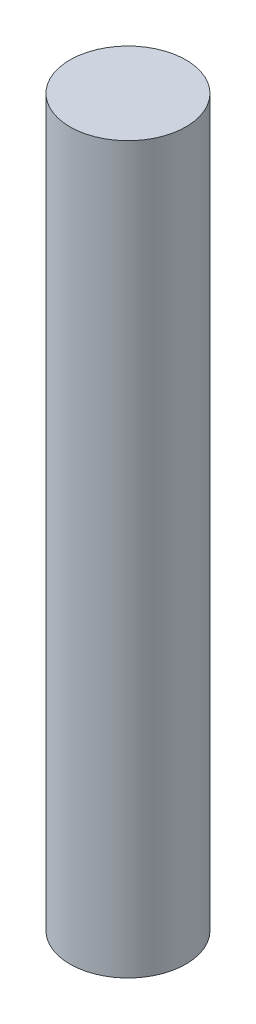
ISO-10303-21;
HEADER;
FILE_DESCRIPTION(('STEP AP214'),'2;1');
FILE_NAME('part.step','',(''),(''),'','','');
FILE_SCHEMA(('AUTOMOTIVE_DESIGN { 1 0 10303 214 1 1 1 1 }'));
ENDSEC;
DATA;
#1=APPLICATION_CONTEXT('core data for automotive mechanical design processes');
#2=APPLICATION_PROTOCOL_DEFINITION('international standard','automotive_design',2000,#1);
#3=PRODUCT_CONTEXT('',#1,'mechanical');
#4=PRODUCT('Part','Part','',(#3));
#5=PRODUCT_RELATED_PRODUCT_CATEGORY('part','',(#4));
#6=PRODUCT_DEFINITION_FORMATION('','',#4);
#7=PRODUCT_DEFINITION_CONTEXT('part definition',#1,'design');
#8=PRODUCT_DEFINITION('design','',#6,#7);
#9=PRODUCT_DEFINITION_SHAPE('','',#8);
#10=(LENGTH_UNIT() NAMED_UNIT(*) SI_UNIT(.MILLI.,.METRE.));
#11=(NAMED_UNIT(*) PLANE_ANGLE_UNIT() SI_UNIT($,.RADIAN.));
#12=(NAMED_UNIT(*) SI_UNIT($,.STERADIAN.) SOLID_ANGLE_UNIT());
#13=UNCERTAINTY_MEASURE_WITH_UNIT(LENGTH_MEASURE(1.E-05),#10,'distance_accuracy_value','');
#14=(GEOMETRIC_REPRESENTATION_CONTEXT(3) GLOBAL_UNCERTAINTY_ASSIGNED_CONTEXT((#13)) GLOBAL_UNIT_ASSIGNED_CONTEXT((#10,
#11,#12)) REPRESENTATION_CONTEXT('',''));
#15=CARTESIAN_POINT('',(0.,0.,0.));
#16=DIRECTION('',(0.,0.,1.));
#17=DIRECTION('',(1.,0.,0.));
#18=AXIS2_PLACEMENT_3D('',#15,#16,#17);
#19=CARTESIAN_POINT('',(0.,30.,0.));
#20=DIRECTION('',(0.,-1.,0.));
#21=DIRECTION('',(0.,0.,-1.));
#22=AXIS2_PLACEMENT_3D('',#19,#20,#21);
#23=CYLINDRICAL_SURFACE('',#22,2.4);
#24=CARTESIAN_POINT('',(0.,30.,0.));
#25=DIRECTION('',(0.,1.,0.));
#26=DIRECTION('',(0.,0.,1.));
#27=AXIS2_PLACEMENT_3D('',#24,#25,#26);
#28=CIRCLE('',#27,2.4);
#29=CARTESIAN_POINT('',(0.,30.,2.4));
#30=VERTEX_POINT('',#29);
#31=EDGE_CURVE('E10',#30,#30,#28,.T.);
#32=ORIENTED_EDGE('',*,*,#31,.F.);
#33=EDGE_LOOP('',(#32));
#34=FACE_BOUND('',#33,.T.);
#35=CARTESIAN_POINT('',(0.,0.,0.));
#36=DIRECTION('',(0.,1.,0.));
#37=DIRECTION('',(0.,0.,1.));
#38=AXIS2_PLACEMENT_3D('',#35,#36,#37);
#39=CIRCLE('',#38,2.4);
#40=CARTESIAN_POINT('',(0.,0.,2.4));
#41=VERTEX_POINT('',#40);
#42=EDGE_CURVE('E34',#41,#41,#39,.T.);
#43=ORIENTED_EDGE('',*,*,#42,.T.);
#44=EDGE_LOOP('',(#43));
#45=FACE_BOUND('',#44,.T.);
#46=ADVANCED_FACE('F31',(#34,#45),#23,.T.);
#47=CARTESIAN_POINT('',(0.,30.,0.));
#48=DIRECTION('',(0.,1.,0.));
#49=DIRECTION('',(0.,0.,1.));
#50=AXIS2_PLACEMENT_3D('',#47,#48,#49);
#51=PLANE('',#50);
#52=ORIENTED_EDGE('',*,*,#31,.T.);
#53=EDGE_LOOP('',(#52));
#54=FACE_BOUND('',#53,.T.);
#55=ADVANCED_FACE('F46',(#54),#51,.T.);
#56=CARTESIAN_POINT('',(0.,0.,0.));
#57=DIRECTION('',(0.,1.,0.));
#58=DIRECTION('',(0.,0.,1.));
#59=AXIS2_PLACEMENT_3D('',#56,#57,#58);
#60=PLANE('',#59);
#61=ORIENTED_EDGE('',*,*,#42,.F.);
#62=EDGE_LOOP('',(#61));
#63=FACE_BOUND('',#62,.T.);
#64=ADVANCED_FACE('F44',(#63),#60,.F.);
#65=CLOSED_SHELL('',(#46,#55,#64));
#66=MANIFOLD_SOLID_BREP('B2',#65);
#67=ADVANCED_BREP_SHAPE_REPRESENTATION('',(#18,#66),#14);
#68=SHAPE_DEFINITION_REPRESENTATION(#9,#67);
ENDSEC;
END-ISO-10303-21;
